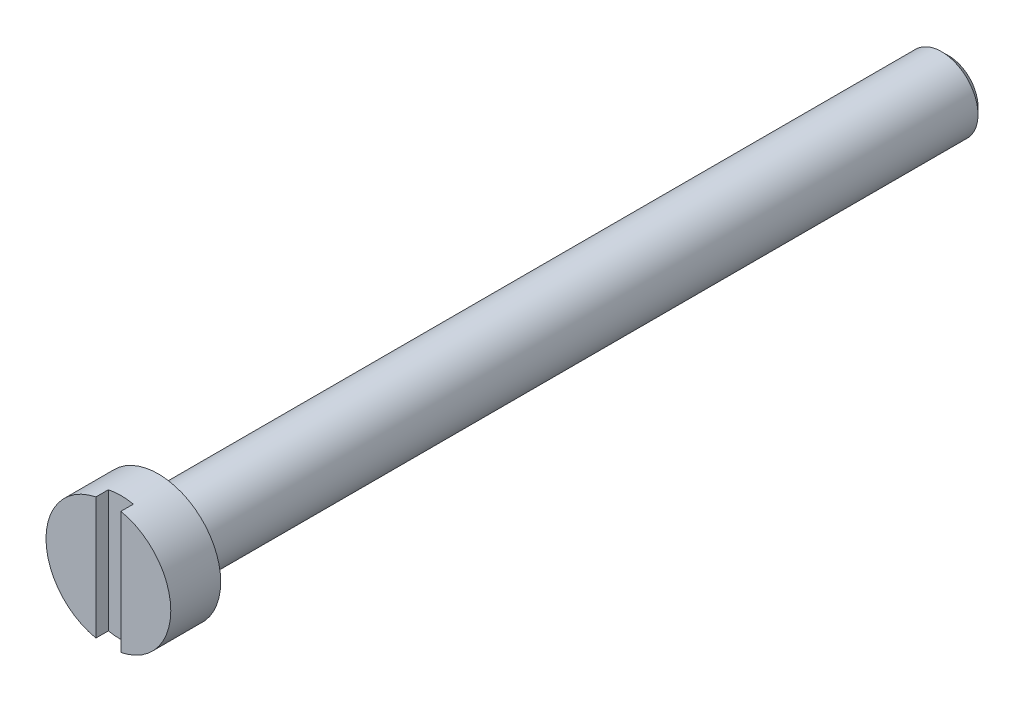
ISO-10303-21;
HEADER;
FILE_DESCRIPTION(('STEP AP214'),'2;1');
FILE_NAME('part.step','',(''),(''),'','','');
FILE_SCHEMA(('AUTOMOTIVE_DESIGN { 1 0 10303 214 1 1 1 1 }'));
ENDSEC;
DATA;
#1=APPLICATION_CONTEXT('core data for automotive mechanical design processes');
#2=APPLICATION_PROTOCOL_DEFINITION('international standard','automotive_design',2000,#1);
#3=PRODUCT_CONTEXT('',#1,'mechanical');
#4=PRODUCT('Part','Part','',(#3));
#5=PRODUCT_RELATED_PRODUCT_CATEGORY('part','',(#4));
#6=PRODUCT_DEFINITION_FORMATION('','',#4);
#7=PRODUCT_DEFINITION_CONTEXT('part definition',#1,'design');
#8=PRODUCT_DEFINITION('design','',#6,#7);
#9=PRODUCT_DEFINITION_SHAPE('','',#8);
#10=(LENGTH_UNIT() NAMED_UNIT(*) SI_UNIT(.MILLI.,.METRE.));
#11=(NAMED_UNIT(*) PLANE_ANGLE_UNIT() SI_UNIT($,.RADIAN.));
#12=(NAMED_UNIT(*) SI_UNIT($,.STERADIAN.) SOLID_ANGLE_UNIT());
#13=UNCERTAINTY_MEASURE_WITH_UNIT(LENGTH_MEASURE(1.E-05),#10,'distance_accuracy_value','');
#14=(GEOMETRIC_REPRESENTATION_CONTEXT(3) GLOBAL_UNCERTAINTY_ASSIGNED_CONTEXT((#13)) GLOBAL_UNIT_ASSIGNED_CONTEXT((#10,
#11,#12)) REPRESENTATION_CONTEXT('',''));
#15=CARTESIAN_POINT('',(0.,0.,0.));
#16=DIRECTION('',(0.,0.,1.));
#17=DIRECTION('',(1.,0.,0.));
#18=AXIS2_PLACEMENT_3D('',#15,#16,#17);
#19=CARTESIAN_POINT('',(0.,0.,2.4));
#20=DIRECTION('',(0.,0.,-1.));
#21=DIRECTION('',(-1.,0.,0.));
#22=AXIS2_PLACEMENT_3D('',#19,#20,#21);
#23=CYLINDRICAL_SURFACE('',#22,3.);
#24=CARTESIAN_POINT('',(0.,0.,0.));
#25=DIRECTION('',(0.,0.,1.));
#26=DIRECTION('',(1.,0.,0.));
#27=AXIS2_PLACEMENT_3D('',#24,#25,#26);
#28=CIRCLE('',#27,3.);
#29=CARTESIAN_POINT('',(3.,0.,0.));
#30=VERTEX_POINT('',#29);
#31=EDGE_CURVE('E114',#30,#30,#28,.T.);
#32=ORIENTED_EDGE('',*,*,#31,.T.);
#33=EDGE_LOOP('',(#32));
#34=FACE_BOUND('',#33,.T.);
#35=DIRECTION('',(0.,0.,-1.));
#36=VECTOR('',#35,1.);
#37=CARTESIAN_POINT('',(0.600000000000028,-2.93938769133982,2.4));
#38=LINE('',#37,#36);
#39=CARTESIAN_POINT('',(0.600000000000028,-2.93938769133982,1.8));
#40=VERTEX_POINT('',#39);
#41=CARTESIAN_POINT('',(0.600000000000028,-2.93938769133982,2.4));
#42=VERTEX_POINT('',#41);
#43=EDGE_CURVE('E73',#40,#42,#38,.F.);
#44=ORIENTED_EDGE('',*,*,#43,.F.);
#45=CARTESIAN_POINT('',(0.,0.,1.8));
#46=DIRECTION('',(0.,0.,1.));
#47=DIRECTION('',(1.,0.,0.));
#48=AXIS2_PLACEMENT_3D('',#45,#46,#47);
#49=CIRCLE('',#48,3.);
#50=CARTESIAN_POINT('',(-0.599999999999972,-2.93938769133982,1.8));
#51=VERTEX_POINT('',#50);
#52=EDGE_CURVE('E13',#51,#40,#49,.T.);
#53=ORIENTED_EDGE('',*,*,#52,.F.);
#54=DIRECTION('',(0.,0.,-1.));
#55=VECTOR('',#54,1.);
#56=CARTESIAN_POINT('',(-0.599999999999972,-2.93938769133982,2.4));
#57=LINE('',#56,#55);
#58=CARTESIAN_POINT('',(-0.599999999999972,-2.93938769133982,2.4));
#59=VERTEX_POINT('',#58);
#60=EDGE_CURVE('E102',#59,#51,#57,.T.);
#61=ORIENTED_EDGE('',*,*,#60,.F.);
#62=CARTESIAN_POINT('',(0.,0.,2.4));
#63=DIRECTION('',(0.,0.,1.));
#64=DIRECTION('',(1.,0.,0.));
#65=AXIS2_PLACEMENT_3D('',#62,#63,#64);
#66=CIRCLE('',#65,3.);
#67=CARTESIAN_POINT('',(-0.599999999999972,2.93938769133981,2.4));
#68=VERTEX_POINT('',#67);
#69=EDGE_CURVE('E106',#68,#59,#66,.T.);
#70=ORIENTED_EDGE('',*,*,#69,.F.);
#71=DIRECTION('',(0.,0.,-1.));
#72=VECTOR('',#71,1.);
#73=CARTESIAN_POINT('',(-0.599999999999972,2.93938769133981,2.4));
#74=LINE('',#73,#72);
#75=CARTESIAN_POINT('',(-0.599999999999972,2.93938769133981,1.8));
#76=VERTEX_POINT('',#75);
#77=EDGE_CURVE('E65',#76,#68,#74,.F.);
#78=ORIENTED_EDGE('',*,*,#77,.F.);
#79=CARTESIAN_POINT('',(0.600000000000028,2.93938769133981,1.8));
#80=VERTEX_POINT('',#79);
#81=EDGE_CURVE('E54',#80,#76,#49,.T.);
#82=ORIENTED_EDGE('',*,*,#81,.F.);
#83=DIRECTION('',(0.,0.,-1.));
#84=VECTOR('',#83,1.);
#85=CARTESIAN_POINT('',(0.600000000000028,2.93938769133981,2.4));
#86=LINE('',#85,#84);
#87=CARTESIAN_POINT('',(0.600000000000028,2.93938769133981,2.4));
#88=VERTEX_POINT('',#87);
#89=EDGE_CURVE('E112',#88,#80,#86,.T.);
#90=ORIENTED_EDGE('',*,*,#89,.F.);
#91=EDGE_CURVE('E115',#42,#88,#66,.T.);
#92=ORIENTED_EDGE('',*,*,#91,.F.);
#93=EDGE_LOOP('',(#44,#53,#61,#70,#78,#82,#90,#92));
#94=FACE_BOUND('',#93,.T.);
#95=ADVANCED_FACE('F50',(#34,#94),#23,.T.);
#96=CARTESIAN_POINT('',(0.,0.,2.4));
#97=DIRECTION('',(0.,0.,1.));
#98=DIRECTION('',(1.,0.,0.));
#99=AXIS2_PLACEMENT_3D('',#96,#97,#98);
#100=PLANE('',#99);
#101=ORIENTED_EDGE('',*,*,#91,.T.);
#102=DIRECTION('',(0.,-1.,0.));
#103=VECTOR('',#102,1.);
#104=CARTESIAN_POINT('',(0.600000000000028,0.,2.4));
#105=LINE('',#104,#103);
#106=EDGE_CURVE('E99',#88,#42,#105,.T.);
#107=ORIENTED_EDGE('',*,*,#106,.T.);
#108=EDGE_LOOP('',(#101,#107));
#109=FACE_BOUND('',#108,.T.);
#110=ADVANCED_FACE('F132',(#109),#100,.T.);
#111=ORIENTED_EDGE('',*,*,#69,.T.);
#112=DIRECTION('',(0.,1.,0.));
#113=VECTOR('',#112,1.);
#114=CARTESIAN_POINT('',(-0.599999999999972,0.,2.4));
#115=LINE('',#114,#113);
#116=EDGE_CURVE('E129',#59,#68,#115,.T.);
#117=ORIENTED_EDGE('',*,*,#116,.T.);
#118=EDGE_LOOP('',(#111,#117));
#119=FACE_BOUND('',#118,.T.);
#120=ADVANCED_FACE('F148',(#119),#100,.T.);
#121=CARTESIAN_POINT('',(0.,0.,0.));
#122=DIRECTION('',(0.,0.,1.));
#123=DIRECTION('',(1.,0.,0.));
#124=AXIS2_PLACEMENT_3D('',#121,#122,#123);
#125=PLANE('',#124);
#126=ORIENTED_EDGE('',*,*,#31,.F.);
#127=EDGE_LOOP('',(#126));
#128=FACE_BOUND('',#127,.T.);
#129=CARTESIAN_POINT('',(0.,0.,0.));
#130=DIRECTION('',(0.,0.,1.));
#131=DIRECTION('',(1.,0.,0.));
#132=AXIS2_PLACEMENT_3D('',#129,#130,#131);
#133=CIRCLE('',#132,1.75);
#134=CARTESIAN_POINT('',(1.75,0.,0.));
#135=VERTEX_POINT('',#134);
#136=EDGE_CURVE('E120',#135,#135,#133,.F.);
#137=ORIENTED_EDGE('',*,*,#136,.F.);
#138=EDGE_LOOP('',(#137));
#139=FACE_BOUND('',#138,.T.);
#140=ADVANCED_FACE('F151',(#128,#139),#125,.F.);
#141=CARTESIAN_POINT('',(0.,0.,-38.));
#142=DIRECTION('',(0.,0.,1.));
#143=DIRECTION('',(1.,0.,0.));
#144=AXIS2_PLACEMENT_3D('',#141,#142,#143);
#145=CYLINDRICAL_SURFACE('',#144,1.75);
#146=CARTESIAN_POINT('',(0.,0.,-37.6645));
#147=DIRECTION('',(0.,0.,-1.));
#148=DIRECTION('',(-1.,0.,0.));
#149=AXIS2_PLACEMENT_3D('',#146,#147,#148);
#150=CIRCLE('',#149,1.75);
#151=CARTESIAN_POINT('',(1.75,0.,-37.6645));
#152=VERTEX_POINT('',#151);
#153=EDGE_CURVE('E126',#152,#152,#150,.F.);
#154=ORIENTED_EDGE('',*,*,#153,.T.);
#155=EDGE_LOOP('',(#154));
#156=FACE_BOUND('',#155,.T.);
#157=ORIENTED_EDGE('',*,*,#136,.T.);
#158=EDGE_LOOP('',(#157));
#159=FACE_BOUND('',#158,.T.);
#160=ADVANCED_FACE('F153',(#156,#159),#145,.T.);
#161=CARTESIAN_POINT('',(0.,0.,-38.));
#162=DIRECTION('',(0.,0.,-1.));
#163=DIRECTION('',(-1.,0.,0.));
#164=AXIS2_PLACEMENT_3D('',#161,#162,#163);
#165=PLANE('',#164);
#166=CARTESIAN_POINT('',(0.,0.,-38.));
#167=DIRECTION('',(0.,0.,-1.));
#168=DIRECTION('',(-1.,0.,0.));
#169=AXIS2_PLACEMENT_3D('',#166,#167,#168);
#170=CIRCLE('',#169,1.4145);
#171=CARTESIAN_POINT('',(1.4145,0.,-38.));
#172=VERTEX_POINT('',#171);
#173=EDGE_CURVE('E123',#172,#172,#170,.T.);
#174=ORIENTED_EDGE('',*,*,#173,.T.);
#175=EDGE_LOOP('',(#174));
#176=FACE_BOUND('',#175,.T.);
#177=ADVANCED_FACE('F157',(#176),#165,.T.);
#178=CARTESIAN_POINT('',(0.,0.,-38.));
#179=DIRECTION('',(0.,0.,1.));
#180=DIRECTION('',(1.,0.,0.));
#181=AXIS2_PLACEMENT_3D('',#178,#179,#180);
#182=CONICAL_SURFACE('',#181,1.4145,0.785398163397446);
#183=CARTESIAN_POINT('',(1.75,0.,-37.6645));
#184=CARTESIAN_POINT('',(1.74650520833333,0.,-37.6679947916667));
#185=CARTESIAN_POINT('',(1.74301041666666,0.,-37.6714895833333));
#186=CARTESIAN_POINT('',(1.73602083333333,0.,-37.6784791666667));
#187=CARTESIAN_POINT('',(1.73252604166666,0.,-37.6819739583333));
#188=CARTESIAN_POINT('',(1.72553645833333,0.,-37.6889635416667));
#189=CARTESIAN_POINT('',(1.72204166666666,0.,-37.6924583333333));
#190=CARTESIAN_POINT('',(1.71505208333333,0.,-37.6994479166667));
#191=CARTESIAN_POINT('',(1.71155729166666,0.,-37.7029427083333));
#192=CARTESIAN_POINT('',(1.70456770833333,0.,-37.7099322916667));
#193=CARTESIAN_POINT('',(1.70107291666666,0.,-37.7134270833333));
#194=CARTESIAN_POINT('',(1.69408333333333,0.,-37.7204166666667));
#195=CARTESIAN_POINT('',(1.69058854166666,0.,-37.7239114583333));
#196=CARTESIAN_POINT('',(1.68359895833333,0.,-37.7309010416667));
#197=CARTESIAN_POINT('',(1.68010416666666,0.,-37.7343958333333));
#198=CARTESIAN_POINT('',(1.67311458333333,0.,-37.7413854166667));
#199=CARTESIAN_POINT('',(1.66961979166666,0.,-37.7448802083333));
#200=CARTESIAN_POINT('',(1.66263020833333,0.,-37.7518697916667));
#201=CARTESIAN_POINT('',(1.65913541666666,0.,-37.7553645833333));
#202=CARTESIAN_POINT('',(1.65214583333333,0.,-37.7623541666667));
#203=CARTESIAN_POINT('',(1.64865104166666,0.,-37.7658489583333));
#204=CARTESIAN_POINT('',(1.64166145833333,0.,-37.7728385416667));
#205=CARTESIAN_POINT('',(1.63816666666666,0.,-37.7763333333333));
#206=CARTESIAN_POINT('',(1.63117708333333,0.,-37.7833229166667));
#207=CARTESIAN_POINT('',(1.62768229166666,0.,-37.7868177083333));
#208=CARTESIAN_POINT('',(1.62069270833333,0.,-37.7938072916667));
#209=CARTESIAN_POINT('',(1.61719791666666,0.,-37.7973020833333));
#210=CARTESIAN_POINT('',(1.61020833333333,0.,-37.8042916666667));
#211=CARTESIAN_POINT('',(1.60671354166666,0.,-37.8077864583333));
#212=CARTESIAN_POINT('',(1.59972395833333,0.,-37.8147760416667));
#213=CARTESIAN_POINT('',(1.59622916666666,0.,-37.8182708333333));
#214=CARTESIAN_POINT('',(1.58923958333333,0.,-37.8252604166667));
#215=CARTESIAN_POINT('',(1.58574479166666,0.,-37.8287552083333));
#216=CARTESIAN_POINT('',(1.57875520833333,0.,-37.8357447916667));
#217=CARTESIAN_POINT('',(1.57526041666666,0.,-37.8392395833333));
#218=CARTESIAN_POINT('',(1.56827083333333,0.,-37.8462291666667));
#219=CARTESIAN_POINT('',(1.56477604166666,0.,-37.8497239583333));
#220=CARTESIAN_POINT('',(1.55778645833333,0.,-37.8567135416667));
#221=CARTESIAN_POINT('',(1.55429166666666,0.,-37.8602083333333));
#222=CARTESIAN_POINT('',(1.54730208333333,0.,-37.8671979166667));
#223=CARTESIAN_POINT('',(1.54380729166666,0.,-37.8706927083333));
#224=CARTESIAN_POINT('',(1.53681770833333,0.,-37.8776822916667));
#225=CARTESIAN_POINT('',(1.53332291666666,0.,-37.8811770833333));
#226=CARTESIAN_POINT('',(1.52633333333333,0.,-37.8881666666667));
#227=CARTESIAN_POINT('',(1.52283854166666,0.,-37.8916614583333));
#228=CARTESIAN_POINT('',(1.51584895833333,0.,-37.8986510416667));
#229=CARTESIAN_POINT('',(1.51235416666666,0.,-37.9021458333333));
#230=CARTESIAN_POINT('',(1.50536458333333,0.,-37.9091354166667));
#231=CARTESIAN_POINT('',(1.50186979166666,0.,-37.9126302083333));
#232=CARTESIAN_POINT('',(1.49488020833333,0.,-37.9196197916667));
#233=CARTESIAN_POINT('',(1.49138541666666,0.,-37.9231145833333));
#234=CARTESIAN_POINT('',(1.48439583333333,0.,-37.9301041666667));
#235=CARTESIAN_POINT('',(1.48090104166666,0.,-37.9335989583333));
#236=CARTESIAN_POINT('',(1.47391145833333,0.,-37.9405885416667));
#237=CARTESIAN_POINT('',(1.47041666666666,0.,-37.9440833333333));
#238=CARTESIAN_POINT('',(1.46342708333333,0.,-37.9510729166667));
#239=CARTESIAN_POINT('',(1.45993229166666,0.,-37.9545677083333));
#240=CARTESIAN_POINT('',(1.45294270833333,0.,-37.9615572916667));
#241=CARTESIAN_POINT('',(1.44944791666666,0.,-37.9650520833333));
#242=CARTESIAN_POINT('',(1.44245833333333,0.,-37.9720416666667));
#243=CARTESIAN_POINT('',(1.43896354166666,0.,-37.9755364583333));
#244=CARTESIAN_POINT('',(1.43197395833333,0.,-37.9825260416667));
#245=CARTESIAN_POINT('',(1.42847916666666,0.,-37.9860208333333));
#246=CARTESIAN_POINT('',(1.42148958333333,0.,-37.9930104166667));
#247=CARTESIAN_POINT('',(1.41799479166666,0.,-37.9965052083333));
#248=CARTESIAN_POINT('',(1.4145,0.,-38.));
#249=B_SPLINE_CURVE_WITH_KNOTS('',3,(#183,#184,#185,#186,#187,#188,#189,#190,#191,#192,#193,
#194,#195,#196,#197,#198,#199,#200,#201,#202,#203,#204,#205,#206,#207,#208,#209,#210,#211,#212,
#213,#214,#215,#216,#217,#218,#219,#220,#221,#222,#223,#224,#225,#226,#227,#228,#229,#230,#231,
#232,#233,#234,#235,#236,#237,#238,#239,#240,#241,#242,#243,#244,#245,#246,#247,#248),
.UNSPECIFIED.,.F.,.F.,(4,2,2,2,2,2,2,2,2,2,2,2,2,2,2,2,2,2,2,2,2,2,2,2,2,2,2,2,2,2,2,2,4),(0.,
0.0148271453180064,0.0296542906360129,0.0444814359540193,0.0593085812720258,0.0741357265900322,
0.0889628719080336,0.10379001722604,0.118617162544047,0.133444307862053,0.148271453180059,
0.163098598498061,0.177925743816067,0.192752889134074,0.20758003445208,0.222407179770087,
0.237234325088088,0.252061470406095,0.266888615724101,0.281715761042107,0.296542906360114,
0.31137005167812,0.326197196996122,0.341024342314128,0.355851487632135,0.370678632950141,
0.385505778268147,0.400332923586149,0.415160068904155,0.429987214222162,0.444814359540168,
0.459641504858175,0.474468650176176),.UNSPECIFIED.);
#250=EDGE_CURVE('BSEAM52',#152,#172,#249,.T.);
#251=ORIENTED_EDGE('',*,*,#153,.F.);
#252=ORIENTED_EDGE('',*,*,#173,.F.);
#253=ORIENTED_EDGE('',*,*,#250,.T.);
#254=ORIENTED_EDGE('',*,*,#250,.F.);
#255=EDGE_LOOP('',(#251,#253,#252,#254));
#256=FACE_BOUND('',#255,.T.);
#257=ADVANCED_FACE('F52',(#256),#182,.T.);
#258=CARTESIAN_POINT('',(-0.599999999999972,38.,1.80000000000001));
#259=DIRECTION('',(0.,0.,1.));
#260=DIRECTION('',(1.,0.,0.));
#261=AXIS2_PLACEMENT_3D('',#258,#259,#260);
#262=PLANE('',#261);
#263=ORIENTED_EDGE('',*,*,#81,.T.);
#264=DIRECTION('',(0.,-1.,0.));
#265=VECTOR('',#264,1.);
#266=CARTESIAN_POINT('',(-0.599999999999972,38.,1.80000000000001));
#267=LINE('',#266,#265);
#268=EDGE_CURVE('E94',#76,#51,#267,.T.);
#269=ORIENTED_EDGE('',*,*,#268,.T.);
#270=ORIENTED_EDGE('',*,*,#52,.T.);
#271=DIRECTION('',(0.,-1.,0.));
#272=VECTOR('',#271,1.);
#273=CARTESIAN_POINT('',(0.600000000000028,38.,1.80000000000001));
#274=LINE('',#273,#272);
#275=EDGE_CURVE('E96',#80,#40,#274,.T.);
#276=ORIENTED_EDGE('',*,*,#275,.F.);
#277=EDGE_LOOP('',(#263,#269,#270,#276));
#278=FACE_BOUND('',#277,.T.);
#279=ADVANCED_FACE('F93',(#278),#262,.T.);
#280=CARTESIAN_POINT('',(0.600000000000028,38.,1.80000000000001));
#281=DIRECTION('',(-1.,0.,0.));
#282=DIRECTION('',(0.,0.,1.));
#283=AXIS2_PLACEMENT_3D('',#280,#281,#282);
#284=PLANE('',#283);
#285=ORIENTED_EDGE('',*,*,#89,.T.);
#286=ORIENTED_EDGE('',*,*,#275,.T.);
#287=ORIENTED_EDGE('',*,*,#43,.T.);
#288=ORIENTED_EDGE('',*,*,#106,.F.);
#289=EDGE_LOOP('',(#285,#286,#287,#288));
#290=FACE_BOUND('',#289,.T.);
#291=ADVANCED_FACE('F133',(#290),#284,.T.);
#292=CARTESIAN_POINT('',(-0.599999999999972,38.,1.80000000000001));
#293=DIRECTION('',(1.,0.,0.));
#294=DIRECTION('',(0.,0.,-1.));
#295=AXIS2_PLACEMENT_3D('',#292,#293,#294);
#296=PLANE('',#295);
#297=ORIENTED_EDGE('',*,*,#60,.T.);
#298=ORIENTED_EDGE('',*,*,#268,.F.);
#299=ORIENTED_EDGE('',*,*,#77,.T.);
#300=ORIENTED_EDGE('',*,*,#116,.F.);
#301=EDGE_LOOP('',(#297,#298,#299,#300));
#302=FACE_BOUND('',#301,.T.);
#303=ADVANCED_FACE('F100',(#302),#296,.T.);
#304=CLOSED_SHELL('',(#95,#110,#120,#140,#160,#177,#257,#279,#291,#303));
#305=MANIFOLD_SOLID_BREP('B2',#304);
#306=ADVANCED_BREP_SHAPE_REPRESENTATION('',(#18,#305),#14);
#307=SHAPE_DEFINITION_REPRESENTATION(#9,#306);
ENDSEC;
END-ISO-10303-21;
